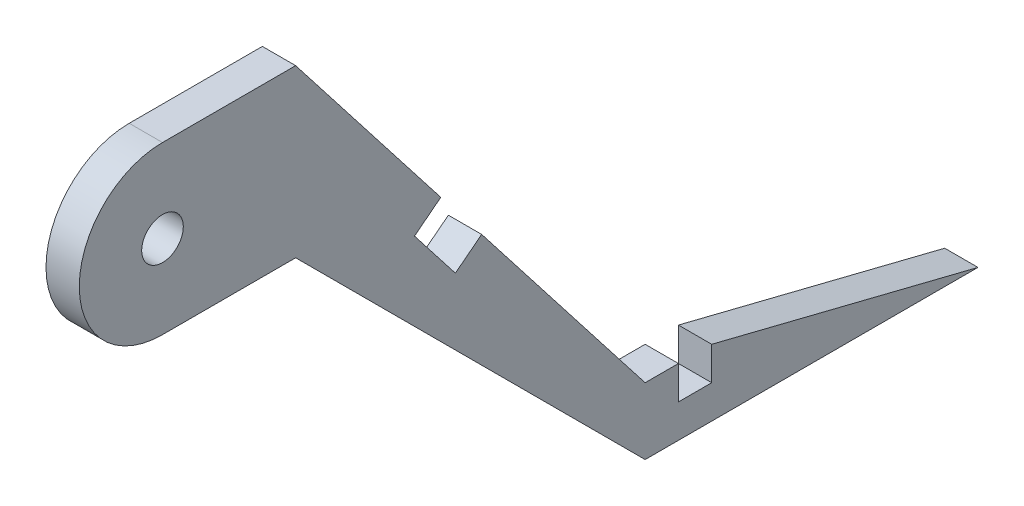
ISO-10303-21;
HEADER;
FILE_DESCRIPTION(('STEP AP214'),'2;1');
FILE_NAME('part.step','',(''),(''),'','','');
FILE_SCHEMA(('AUTOMOTIVE_DESIGN { 1 0 10303 214 1 1 1 1 }'));
ENDSEC;
DATA;
#1=APPLICATION_CONTEXT('core data for automotive mechanical design processes');
#2=APPLICATION_PROTOCOL_DEFINITION('international standard','automotive_design',2000,#1);
#3=PRODUCT_CONTEXT('',#1,'mechanical');
#4=PRODUCT('Part','Part','',(#3));
#5=PRODUCT_RELATED_PRODUCT_CATEGORY('part','',(#4));
#6=PRODUCT_DEFINITION_FORMATION('','',#4);
#7=PRODUCT_DEFINITION_CONTEXT('part definition',#1,'design');
#8=PRODUCT_DEFINITION('design','',#6,#7);
#9=PRODUCT_DEFINITION_SHAPE('','',#8);
#10=(LENGTH_UNIT() NAMED_UNIT(*) SI_UNIT(.MILLI.,.METRE.));
#11=(NAMED_UNIT(*) PLANE_ANGLE_UNIT() SI_UNIT($,.RADIAN.));
#12=(NAMED_UNIT(*) SI_UNIT($,.STERADIAN.) SOLID_ANGLE_UNIT());
#13=UNCERTAINTY_MEASURE_WITH_UNIT(LENGTH_MEASURE(1.E-05),#10,'distance_accuracy_value','');
#14=(GEOMETRIC_REPRESENTATION_CONTEXT(3) GLOBAL_UNCERTAINTY_ASSIGNED_CONTEXT((#13)) GLOBAL_UNIT_ASSIGNED_CONTEXT((#10,
#11,#12)) REPRESENTATION_CONTEXT('',''));
#15=CARTESIAN_POINT('',(0.,0.,0.));
#16=DIRECTION('',(0.,0.,1.));
#17=DIRECTION('',(1.,0.,0.));
#18=AXIS2_PLACEMENT_3D('',#15,#16,#17);
#19=CARTESIAN_POINT('',(12.7,-139.7,-184.150000000001));
#20=DIRECTION('',(0.,-0.613940613514922,0.789352217376325));
#21=DIRECTION('',(0.,-0.789352217376325,-0.613940613514922));
#22=AXIS2_PLACEMENT_3D('',#19,#20,#21);
#23=PLANE('',#22);
#24=DIRECTION('',(0.,0.789352217376325,0.613940613514922));
#25=VECTOR('',#24,1.);
#26=CARTESIAN_POINT('',(12.7,-139.7,-184.150000000001));
#27=LINE('',#26,#25);
#28=CARTESIAN_POINT('',(12.7,-39.4522683932067,-106.179542083605));
#29=VERTEX_POINT('',#28);
#30=CARTESIAN_POINT('',(12.7,31.75,-50.8));
#31=VERTEX_POINT('',#30);
#32=EDGE_CURVE('E234',#29,#31,#27,.T.);
#33=ORIENTED_EDGE('',*,*,#32,.F.);
#34=DIRECTION('',(1.,0.,0.));
#35=VECTOR('',#34,1.);
#36=CARTESIAN_POINT('',(12.7,-39.4522683932067,-106.179542083605));
#37=LINE('',#36,#35);
#38=CARTESIAN_POINT('',(0.,-39.4522683932067,-106.179542083605));
#39=VERTEX_POINT('',#38);
#40=EDGE_CURVE('E277',#39,#29,#37,.T.);
#41=ORIENTED_EDGE('',*,*,#40,.F.);
#42=DIRECTION('',(0.,0.789352217376325,0.613940613514922));
#43=VECTOR('',#42,1.);
#44=CARTESIAN_POINT('',(0.,-139.7,-184.150000000001));
#45=LINE('',#44,#43);
#46=CARTESIAN_POINT('',(0.,31.75,-50.8));
#47=VERTEX_POINT('',#46);
#48=EDGE_CURVE('E178',#39,#47,#45,.T.);
#49=ORIENTED_EDGE('',*,*,#48,.T.);
#50=DIRECTION('',(-1.,0.,0.));
#51=VECTOR('',#50,1.);
#52=CARTESIAN_POINT('',(12.7,31.75,-50.8));
#53=LINE('',#52,#51);
#54=EDGE_CURVE('E197',#31,#47,#53,.T.);
#55=ORIENTED_EDGE('',*,*,#54,.F.);
#56=EDGE_LOOP('',(#33,#41,#49,#55));
#57=FACE_BOUND('',#56,.T.);
#58=ADVANCED_FACE('F37',(#57),#23,.F.);
#59=CARTESIAN_POINT('',(12.7,-165.1,-311.15));
#60=DIRECTION('',(0.,-0.970142500145331,0.242535625036335));
#61=DIRECTION('',(0.,-0.242535625036335,-0.970142500145331));
#62=AXIS2_PLACEMENT_3D('',#59,#60,#61);
#63=PLANE('',#62);
#64=DIRECTION('',(0.,0.242535625036335,0.970142500145332));
#65=VECTOR('',#64,1.);
#66=CARTESIAN_POINT('',(0.,-165.1,-311.15));
#67=LINE('',#66,#65);
#68=CARTESIAN_POINT('',(0.,-165.1,-311.15));
#69=VERTEX_POINT('',#68);
#70=CARTESIAN_POINT('',(0.,-139.7,-209.550000000001));
#71=VERTEX_POINT('',#70);
#72=EDGE_CURVE('E166',#69,#71,#67,.T.);
#73=ORIENTED_EDGE('',*,*,#72,.T.);
#74=DIRECTION('',(-1.,0.,0.));
#75=VECTOR('',#74,1.);
#76=CARTESIAN_POINT('',(12.7,-139.7,-209.550000000001));
#77=LINE('',#76,#75);
#78=CARTESIAN_POINT('',(12.7,-139.7,-209.550000000001));
#79=VERTEX_POINT('',#78);
#80=EDGE_CURVE('E11',#79,#71,#77,.T.);
#81=ORIENTED_EDGE('',*,*,#80,.F.);
#82=DIRECTION('',(0.,0.242535625036335,0.970142500145332));
#83=VECTOR('',#82,1.);
#84=CARTESIAN_POINT('',(12.7,-165.1,-311.15));
#85=LINE('',#84,#83);
#86=CARTESIAN_POINT('',(12.7,-165.1,-311.15));
#87=VERTEX_POINT('',#86);
#88=EDGE_CURVE('E190',#87,#79,#85,.T.);
#89=ORIENTED_EDGE('',*,*,#88,.F.);
#90=DIRECTION('',(-1.,0.,0.));
#91=VECTOR('',#90,1.);
#92=CARTESIAN_POINT('',(12.7,-165.1,-311.15));
#93=LINE('',#92,#91);
#94=EDGE_CURVE('E162',#87,#69,#93,.T.);
#95=ORIENTED_EDGE('',*,*,#94,.T.);
#96=EDGE_LOOP('',(#73,#81,#89,#95));
#97=FACE_BOUND('',#96,.T.);
#98=ADVANCED_FACE('F39',(#97),#63,.F.);
#99=CARTESIAN_POINT('',(12.7,-139.7,-209.550000000001));
#100=DIRECTION('',(0.,0.,-1.));
#101=DIRECTION('',(0.,1.,0.));
#102=AXIS2_PLACEMENT_3D('',#99,#100,#101);
#103=PLANE('',#102);
#104=DIRECTION('',(0.,-1.,0.));
#105=VECTOR('',#104,1.);
#106=CARTESIAN_POINT('',(0.,-139.7,-209.550000000001));
#107=LINE('',#106,#105);
#108=CARTESIAN_POINT('',(0.,-152.4,-209.550000000001));
#109=VERTEX_POINT('',#108);
#110=EDGE_CURVE('E169',#71,#109,#107,.T.);
#111=ORIENTED_EDGE('',*,*,#110,.T.);
#112=DIRECTION('',(-1.,0.,0.));
#113=VECTOR('',#112,1.);
#114=CARTESIAN_POINT('',(12.7,-152.4,-209.550000000001));
#115=LINE('',#114,#113);
#116=CARTESIAN_POINT('',(12.7,-152.4,-209.550000000001));
#117=VERTEX_POINT('',#116);
#118=EDGE_CURVE('E45',#117,#109,#115,.T.);
#119=ORIENTED_EDGE('',*,*,#118,.F.);
#120=DIRECTION('',(0.,-1.,0.));
#121=VECTOR('',#120,1.);
#122=CARTESIAN_POINT('',(12.7,-139.7,-209.550000000001));
#123=LINE('',#122,#121);
#124=EDGE_CURVE('E111',#79,#117,#123,.T.);
#125=ORIENTED_EDGE('',*,*,#124,.F.);
#126=ORIENTED_EDGE('',*,*,#80,.T.);
#127=EDGE_LOOP('',(#111,#119,#125,#126));
#128=FACE_BOUND('',#127,.T.);
#129=ADVANCED_FACE('F320',(#128),#103,.F.);
#130=CARTESIAN_POINT('',(12.7,-152.4,-209.550000000001));
#131=DIRECTION('',(0.,-1.,0.));
#132=DIRECTION('',(0.,0.,-1.));
#133=AXIS2_PLACEMENT_3D('',#130,#131,#132);
#134=PLANE('',#133);
#135=DIRECTION('',(0.,0.,1.));
#136=VECTOR('',#135,1.);
#137=CARTESIAN_POINT('',(0.,-152.4,-209.550000000001));
#138=LINE('',#137,#136);
#139=CARTESIAN_POINT('',(0.,-152.4,-196.850000000001));
#140=VERTEX_POINT('',#139);
#141=EDGE_CURVE('E172',#109,#140,#138,.T.);
#142=ORIENTED_EDGE('',*,*,#141,.T.);
#143=DIRECTION('',(-1.,0.,0.));
#144=VECTOR('',#143,1.);
#145=CARTESIAN_POINT('',(12.7,-152.4,-196.850000000001));
#146=LINE('',#145,#144);
#147=CARTESIAN_POINT('',(12.7,-152.4,-196.850000000001));
#148=VERTEX_POINT('',#147);
#149=EDGE_CURVE('E206',#148,#140,#146,.T.);
#150=ORIENTED_EDGE('',*,*,#149,.F.);
#151=DIRECTION('',(0.,0.,1.));
#152=VECTOR('',#151,1.);
#153=CARTESIAN_POINT('',(12.7,-152.4,-209.550000000001));
#154=LINE('',#153,#152);
#155=EDGE_CURVE('E214',#117,#148,#154,.T.);
#156=ORIENTED_EDGE('',*,*,#155,.F.);
#157=ORIENTED_EDGE('',*,*,#118,.T.);
#158=EDGE_LOOP('',(#142,#150,#156,#157));
#159=FACE_BOUND('',#158,.T.);
#160=ADVANCED_FACE('F212',(#159),#134,.F.);
#161=CARTESIAN_POINT('',(12.7,-152.4,-196.850000000001));
#162=DIRECTION('',(0.,0.,1.));
#163=DIRECTION('',(1.,0.,0.));
#164=AXIS2_PLACEMENT_3D('',#161,#162,#163);
#165=PLANE('',#164);
#166=DIRECTION('',(0.,1.,0.));
#167=VECTOR('',#166,1.);
#168=CARTESIAN_POINT('',(0.,-152.4,-196.850000000001));
#169=LINE('',#168,#167);
#170=CARTESIAN_POINT('',(0.,-139.7,-196.850000000001));
#171=VERTEX_POINT('',#170);
#172=EDGE_CURVE('E174',#140,#171,#169,.T.);
#173=ORIENTED_EDGE('',*,*,#172,.T.);
#174=DIRECTION('',(-1.,0.,0.));
#175=VECTOR('',#174,1.);
#176=CARTESIAN_POINT('',(12.7,-139.7,-196.850000000001));
#177=LINE('',#176,#175);
#178=CARTESIAN_POINT('',(12.7,-139.7,-196.850000000001));
#179=VERTEX_POINT('',#178);
#180=EDGE_CURVE('E203',#179,#171,#177,.T.);
#181=ORIENTED_EDGE('',*,*,#180,.F.);
#182=DIRECTION('',(0.,1.,0.));
#183=VECTOR('',#182,1.);
#184=CARTESIAN_POINT('',(12.7,-152.4,-196.850000000001));
#185=LINE('',#184,#183);
#186=EDGE_CURVE('E235',#148,#179,#185,.T.);
#187=ORIENTED_EDGE('',*,*,#186,.F.);
#188=ORIENTED_EDGE('',*,*,#149,.T.);
#189=EDGE_LOOP('',(#173,#181,#187,#188));
#190=FACE_BOUND('',#189,.T.);
#191=ADVANCED_FACE('F225',(#190),#165,.F.);
#192=CARTESIAN_POINT('',(12.7,-139.7,-196.850000000001));
#193=DIRECTION('',(0.,-1.,0.));
#194=DIRECTION('',(0.,0.,-1.));
#195=AXIS2_PLACEMENT_3D('',#192,#193,#194);
#196=PLANE('',#195);
#197=DIRECTION('',(0.,0.,1.));
#198=VECTOR('',#197,1.);
#199=CARTESIAN_POINT('',(0.,-139.7,-196.850000000001));
#200=LINE('',#199,#198);
#201=CARTESIAN_POINT('',(0.,-139.7,-184.150000000001));
#202=VERTEX_POINT('',#201);
#203=EDGE_CURVE('E176',#171,#202,#200,.T.);
#204=ORIENTED_EDGE('',*,*,#203,.T.);
#205=DIRECTION('',(-1.,0.,0.));
#206=VECTOR('',#205,1.);
#207=CARTESIAN_POINT('',(12.7,-139.7,-184.150000000001));
#208=LINE('',#207,#206);
#209=CARTESIAN_POINT('',(12.7,-139.7,-184.150000000001));
#210=VERTEX_POINT('',#209);
#211=EDGE_CURVE('E200',#210,#202,#208,.T.);
#212=ORIENTED_EDGE('',*,*,#211,.F.);
#213=DIRECTION('',(0.,0.,1.));
#214=VECTOR('',#213,1.);
#215=CARTESIAN_POINT('',(12.7,-139.7,-196.850000000001));
#216=LINE('',#215,#214);
#217=EDGE_CURVE('E231',#179,#210,#216,.T.);
#218=ORIENTED_EDGE('',*,*,#217,.F.);
#219=ORIENTED_EDGE('',*,*,#180,.T.);
#220=EDGE_LOOP('',(#204,#212,#218,#219));
#221=FACE_BOUND('',#220,.T.);
#222=ADVANCED_FACE('F229',(#221),#196,.F.);
#223=CARTESIAN_POINT('',(0.,-59.5018147145653,-121.773633666885));
#224=VERTEX_POINT('',#223);
#225=EDGE_CURVE('E179',#202,#224,#45,.T.);
#226=ORIENTED_EDGE('',*,*,#225,.T.);
#227=DIRECTION('',(-1.,0.,0.));
#228=VECTOR('',#227,1.);
#229=CARTESIAN_POINT('',(12.7,-59.5018147145653,-121.773633666885));
#230=LINE('',#229,#228);
#231=CARTESIAN_POINT('',(12.7,-59.5018147145653,-121.773633666885));
#232=VERTEX_POINT('',#231);
#233=EDGE_CURVE('E281',#232,#224,#230,.T.);
#234=ORIENTED_EDGE('',*,*,#233,.F.);
#235=EDGE_CURVE('E237',#210,#232,#27,.T.);
#236=ORIENTED_EDGE('',*,*,#235,.F.);
#237=ORIENTED_EDGE('',*,*,#211,.T.);
#238=EDGE_LOOP('',(#226,#234,#236,#237));
#239=FACE_BOUND('',#238,.T.);
#240=ADVANCED_FACE('F303',(#239),#23,.F.);
#241=CARTESIAN_POINT('',(12.7,31.75,0.));
#242=DIRECTION('',(0.,-1.,0.));
#243=DIRECTION('',(0.,0.,-1.));
#244=AXIS2_PLACEMENT_3D('',#241,#242,#243);
#245=PLANE('',#244);
#246=DIRECTION('',(0.,0.,1.));
#247=VECTOR('',#246,1.);
#248=CARTESIAN_POINT('',(0.,31.75,0.));
#249=LINE('',#248,#247);
#250=CARTESIAN_POINT('',(0.,31.75,0.));
#251=VERTEX_POINT('',#250);
#252=EDGE_CURVE('E182',#47,#251,#249,.T.);
#253=ORIENTED_EDGE('',*,*,#252,.T.);
#254=DIRECTION('',(-1.,0.,0.));
#255=VECTOR('',#254,1.);
#256=CARTESIAN_POINT('',(12.7,31.75,0.));
#257=LINE('',#256,#255);
#258=CARTESIAN_POINT('',(12.7,31.75,0.));
#259=VERTEX_POINT('',#258);
#260=EDGE_CURVE('E194',#259,#251,#257,.T.);
#261=ORIENTED_EDGE('',*,*,#260,.F.);
#262=DIRECTION('',(0.,0.,1.));
#263=VECTOR('',#262,1.);
#264=CARTESIAN_POINT('',(12.7,31.75,0.));
#265=LINE('',#264,#263);
#266=EDGE_CURVE('E242',#31,#259,#265,.T.);
#267=ORIENTED_EDGE('',*,*,#266,.F.);
#268=ORIENTED_EDGE('',*,*,#54,.T.);
#269=EDGE_LOOP('',(#253,#261,#267,#268));
#270=FACE_BOUND('',#269,.T.);
#271=ADVANCED_FACE('F248',(#270),#245,.F.);
#272=CARTESIAN_POINT('',(12.7,0.,0.));
#273=DIRECTION('',(-1.,0.,0.));
#274=DIRECTION('',(0.,0.,1.));
#275=AXIS2_PLACEMENT_3D('',#272,#273,#274);
#276=CYLINDRICAL_SURFACE('',#275,31.75);
#277=CARTESIAN_POINT('',(0.,0.,0.));
#278=DIRECTION('',(1.,0.,0.));
#279=DIRECTION('',(0.,0.,-1.));
#280=AXIS2_PLACEMENT_3D('',#277,#278,#279);
#281=CIRCLE('',#280,31.75);
#282=CARTESIAN_POINT('',(0.,-31.75,0.));
#283=VERTEX_POINT('',#282);
#284=EDGE_CURVE('E184',#251,#283,#281,.T.);
#285=ORIENTED_EDGE('',*,*,#284,.T.);
#286=DIRECTION('',(-1.,0.,0.));
#287=VECTOR('',#286,1.);
#288=CARTESIAN_POINT('',(12.7,-31.75,0.));
#289=LINE('',#288,#287);
#290=CARTESIAN_POINT('',(12.7,-31.75,0.));
#291=VERTEX_POINT('',#290);
#292=EDGE_CURVE('E157',#291,#283,#289,.T.);
#293=ORIENTED_EDGE('',*,*,#292,.F.);
#294=CARTESIAN_POINT('',(12.7,0.,0.));
#295=DIRECTION('',(1.,0.,0.));
#296=DIRECTION('',(0.,0.,-1.));
#297=AXIS2_PLACEMENT_3D('',#294,#295,#296);
#298=CIRCLE('',#297,31.75);
#299=EDGE_CURVE('E145',#259,#291,#298,.T.);
#300=ORIENTED_EDGE('',*,*,#299,.F.);
#301=ORIENTED_EDGE('',*,*,#260,.T.);
#302=EDGE_LOOP('',(#285,#293,#300,#301));
#303=FACE_BOUND('',#302,.T.);
#304=ADVANCED_FACE('F252',(#303),#276,.T.);
#305=CARTESIAN_POINT('',(12.7,-31.75,0.));
#306=DIRECTION('',(0.,1.,0.));
#307=DIRECTION('',(0.,0.,1.));
#308=AXIS2_PLACEMENT_3D('',#305,#306,#307);
#309=PLANE('',#308);
#310=DIRECTION('',(0.,0.,-1.));
#311=VECTOR('',#310,1.);
#312=CARTESIAN_POINT('',(0.,-31.75,0.));
#313=LINE('',#312,#311);
#314=CARTESIAN_POINT('',(0.,-31.75,-50.8));
#315=VERTEX_POINT('',#314);
#316=EDGE_CURVE('E154',#283,#315,#313,.T.);
#317=ORIENTED_EDGE('',*,*,#316,.T.);
#318=DIRECTION('',(-1.,0.,0.));
#319=VECTOR('',#318,1.);
#320=CARTESIAN_POINT('',(12.7,-31.75,-50.8));
#321=LINE('',#320,#319);
#322=CARTESIAN_POINT('',(12.7,-31.75,-50.8));
#323=VERTEX_POINT('',#322);
#324=EDGE_CURVE('E151',#323,#315,#321,.T.);
#325=ORIENTED_EDGE('',*,*,#324,.F.);
#326=DIRECTION('',(0.,0.,-1.));
#327=VECTOR('',#326,1.);
#328=CARTESIAN_POINT('',(12.7,-31.75,0.));
#329=LINE('',#328,#327);
#330=EDGE_CURVE('E136',#291,#323,#329,.T.);
#331=ORIENTED_EDGE('',*,*,#330,.F.);
#332=ORIENTED_EDGE('',*,*,#292,.T.);
#333=EDGE_LOOP('',(#317,#325,#331,#332));
#334=FACE_BOUND('',#333,.T.);
#335=ADVANCED_FACE('F152',(#334),#309,.F.);
#336=CARTESIAN_POINT('',(12.7,-31.75,-50.8));
#337=DIRECTION('',(0.,0.707106781186547,-0.707106781186548));
#338=DIRECTION('',(0.,0.707106781186548,0.707106781186547));
#339=AXIS2_PLACEMENT_3D('',#336,#337,#338);
#340=PLANE('',#339);
#341=DIRECTION('',(0.,-0.707106781186548,-0.707106781186546));
#342=VECTOR('',#341,1.);
#343=CARTESIAN_POINT('',(0.,-31.75,-50.8));
#344=LINE('',#343,#342);
#345=CARTESIAN_POINT('',(0.,-165.1,-184.15));
#346=VERTEX_POINT('',#345);
#347=EDGE_CURVE('E187',#315,#346,#344,.T.);
#348=ORIENTED_EDGE('',*,*,#347,.T.);
#349=DIRECTION('',(-1.,0.,0.));
#350=VECTOR('',#349,1.);
#351=CARTESIAN_POINT('',(12.7,-165.1,-184.15));
#352=LINE('',#351,#350);
#353=CARTESIAN_POINT('',(12.7,-165.1,-184.15));
#354=VERTEX_POINT('',#353);
#355=EDGE_CURVE('E158',#354,#346,#352,.T.);
#356=ORIENTED_EDGE('',*,*,#355,.F.);
#357=DIRECTION('',(0.,-0.707106781186548,-0.707106781186546));
#358=VECTOR('',#357,1.);
#359=CARTESIAN_POINT('',(12.7,-31.75,-50.8));
#360=LINE('',#359,#358);
#361=EDGE_CURVE('E142',#323,#354,#360,.T.);
#362=ORIENTED_EDGE('',*,*,#361,.F.);
#363=ORIENTED_EDGE('',*,*,#324,.T.);
#364=EDGE_LOOP('',(#348,#356,#362,#363));
#365=FACE_BOUND('',#364,.T.);
#366=ADVANCED_FACE('F160',(#365),#340,.F.);
#367=CARTESIAN_POINT('',(12.7,-165.1,-184.15));
#368=DIRECTION('',(0.,1.,0.));
#369=DIRECTION('',(0.,0.,1.));
#370=AXIS2_PLACEMENT_3D('',#367,#368,#369);
#371=PLANE('',#370);
#372=DIRECTION('',(0.,0.,-1.));
#373=VECTOR('',#372,1.);
#374=CARTESIAN_POINT('',(0.,-165.1,-184.15));
#375=LINE('',#374,#373);
#376=EDGE_CURVE('E103',#346,#69,#375,.T.);
#377=ORIENTED_EDGE('',*,*,#376,.T.);
#378=ORIENTED_EDGE('',*,*,#94,.F.);
#379=DIRECTION('',(0.,0.,-1.));
#380=VECTOR('',#379,1.);
#381=CARTESIAN_POINT('',(12.7,-165.1,-184.15));
#382=LINE('',#381,#380);
#383=EDGE_CURVE('E61',#354,#87,#382,.T.);
#384=ORIENTED_EDGE('',*,*,#383,.F.);
#385=ORIENTED_EDGE('',*,*,#355,.T.);
#386=EDGE_LOOP('',(#377,#378,#384,#385));
#387=FACE_BOUND('',#386,.T.);
#388=ADVANCED_FACE('F253',(#387),#371,.F.);
#389=CARTESIAN_POINT('',(12.7,0.,0.));
#390=DIRECTION('',(1.,0.,0.));
#391=DIRECTION('',(0.,0.,-1.));
#392=AXIS2_PLACEMENT_3D('',#389,#390,#391);
#393=PLANE('',#392);
#394=DIRECTION('',(0.,0.613940613514922,-0.789352217376325));
#395=VECTOR('',#394,1.);
#396=CARTESIAN_POINT('',(12.7,-47.2493141848462,-96.1547689229262));
#397=LINE('',#396,#395);
#398=CARTESIAN_POINT('',(12.7,-47.2493141848462,-96.1547689229262));
#399=VERTEX_POINT('',#398);
#400=EDGE_CURVE('E265',#399,#29,#397,.T.);
#401=ORIENTED_EDGE('',*,*,#400,.T.);
#402=ORIENTED_EDGE('',*,*,#32,.T.);
#403=ORIENTED_EDGE('',*,*,#266,.T.);
#404=ORIENTED_EDGE('',*,*,#299,.T.);
#405=ORIENTED_EDGE('',*,*,#330,.T.);
#406=ORIENTED_EDGE('',*,*,#361,.T.);
#407=ORIENTED_EDGE('',*,*,#383,.T.);
#408=ORIENTED_EDGE('',*,*,#88,.T.);
#409=ORIENTED_EDGE('',*,*,#124,.T.);
#410=ORIENTED_EDGE('',*,*,#155,.T.);
#411=ORIENTED_EDGE('',*,*,#186,.T.);
#412=ORIENTED_EDGE('',*,*,#217,.T.);
#413=ORIENTED_EDGE('',*,*,#235,.T.);
#414=DIRECTION('',(0.,0.613940613514922,-0.789352217376325));
#415=VECTOR('',#414,1.);
#416=CARTESIAN_POINT('',(12.7,-67.2988605062049,-111.748860506205));
#417=LINE('',#416,#415);
#418=CARTESIAN_POINT('',(12.7,-67.2988605062049,-111.748860506205));
#419=VERTEX_POINT('',#418);
#420=EDGE_CURVE('E266',#419,#232,#417,.T.);
#421=ORIENTED_EDGE('',*,*,#420,.F.);
#422=DIRECTION('',(0.,-0.789352217376325,-0.613940613514922));
#423=VECTOR('',#422,1.);
#424=CARTESIAN_POINT('',(12.7,-47.2493141848462,-96.1547689229262));
#425=LINE('',#424,#423);
#426=EDGE_CURVE('E280',#399,#419,#425,.T.);
#427=ORIENTED_EDGE('',*,*,#426,.F.);
#428=EDGE_LOOP('',(#401,#402,#403,#404,#405,#406,#407,#408,#409,#410,#411,#412,#413,#421,#427));
#429=FACE_BOUND('',#428,.T.);
#430=CARTESIAN_POINT('',(12.7,0.,0.));
#431=DIRECTION('',(1.,0.,0.));
#432=DIRECTION('',(0.,0.,-1.));
#433=AXIS2_PLACEMENT_3D('',#430,#431,#432);
#434=CIRCLE('',#433,7.9375);
#435=CARTESIAN_POINT('',(12.7,0.,-7.9375));
#436=VERTEX_POINT('',#435);
#437=EDGE_CURVE('E262',#436,#436,#434,.T.);
#438=ORIENTED_EDGE('',*,*,#437,.F.);
#439=EDGE_LOOP('',(#438));
#440=FACE_BOUND('',#439,.T.);
#441=ADVANCED_FACE('F139',(#429,#440),#393,.T.);
#442=CARTESIAN_POINT('',(0.,0.,0.));
#443=DIRECTION('',(1.,0.,0.));
#444=DIRECTION('',(0.,0.,-1.));
#445=AXIS2_PLACEMENT_3D('',#442,#443,#444);
#446=PLANE('',#445);
#447=ORIENTED_EDGE('',*,*,#48,.F.);
#448=DIRECTION('',(0.,0.613940613514922,-0.789352217376325));
#449=VECTOR('',#448,1.);
#450=CARTESIAN_POINT('',(0.,-47.2493141848462,-96.1547689229262));
#451=LINE('',#450,#449);
#452=CARTESIAN_POINT('',(0.,-47.2493141848462,-96.1547689229262));
#453=VERTEX_POINT('',#452);
#454=EDGE_CURVE('E273',#453,#39,#451,.T.);
#455=ORIENTED_EDGE('',*,*,#454,.F.);
#456=DIRECTION('',(0.,0.789352217376325,0.613940613514922));
#457=VECTOR('',#456,1.);
#458=CARTESIAN_POINT('',(0.,-47.2493141848462,-96.1547689229262));
#459=LINE('',#458,#457);
#460=CARTESIAN_POINT('',(0.,-67.2988605062049,-111.748860506205));
#461=VERTEX_POINT('',#460);
#462=EDGE_CURVE('E286',#461,#453,#459,.T.);
#463=ORIENTED_EDGE('',*,*,#462,.F.);
#464=DIRECTION('',(0.,0.613940613514922,-0.789352217376325));
#465=VECTOR('',#464,1.);
#466=CARTESIAN_POINT('',(0.,-67.2988605062049,-111.748860506205));
#467=LINE('',#466,#465);
#468=EDGE_CURVE('E269',#461,#224,#467,.T.);
#469=ORIENTED_EDGE('',*,*,#468,.T.);
#470=ORIENTED_EDGE('',*,*,#225,.F.);
#471=ORIENTED_EDGE('',*,*,#203,.F.);
#472=ORIENTED_EDGE('',*,*,#172,.F.);
#473=ORIENTED_EDGE('',*,*,#141,.F.);
#474=ORIENTED_EDGE('',*,*,#110,.F.);
#475=ORIENTED_EDGE('',*,*,#72,.F.);
#476=ORIENTED_EDGE('',*,*,#376,.F.);
#477=ORIENTED_EDGE('',*,*,#347,.F.);
#478=ORIENTED_EDGE('',*,*,#316,.F.);
#479=ORIENTED_EDGE('',*,*,#284,.F.);
#480=ORIENTED_EDGE('',*,*,#252,.F.);
#481=EDGE_LOOP('',(#447,#455,#463,#469,#470,#471,#472,#473,#474,#475,#476,#477,#478,#479,#480));
#482=FACE_BOUND('',#481,.T.);
#483=CARTESIAN_POINT('',(0.,0.,0.));
#484=DIRECTION('',(1.,0.,0.));
#485=DIRECTION('',(0.,0.,-1.));
#486=AXIS2_PLACEMENT_3D('',#483,#484,#485);
#487=CIRCLE('',#486,7.9375);
#488=CARTESIAN_POINT('',(0.,0.,-7.9375));
#489=VERTEX_POINT('',#488);
#490=EDGE_CURVE('E170',#489,#489,#487,.F.);
#491=ORIENTED_EDGE('',*,*,#490,.F.);
#492=EDGE_LOOP('',(#491));
#493=FACE_BOUND('',#492,.T.);
#494=ADVANCED_FACE('F218',(#482,#493),#446,.F.);
#495=CARTESIAN_POINT('',(-22.4506403026729,0.,0.));
#496=DIRECTION('',(1.,0.,0.));
#497=DIRECTION('',(0.,0.,-1.));
#498=AXIS2_PLACEMENT_3D('',#495,#496,#497);
#499=CYLINDRICAL_SURFACE('',#498,7.9375);
#500=ORIENTED_EDGE('',*,*,#490,.T.);
#501=EDGE_LOOP('',(#500));
#502=FACE_BOUND('',#501,.T.);
#503=ORIENTED_EDGE('',*,*,#437,.T.);
#504=EDGE_LOOP('',(#503));
#505=FACE_BOUND('',#504,.T.);
#506=ADVANCED_FACE('F397',(#502,#505),#499,.F.);
#507=CARTESIAN_POINT('',(12.7,-47.2493141848462,-96.1547689229262));
#508=DIRECTION('',(0.,0.789352217376325,0.613940613514922));
#509=DIRECTION('',(0.,-0.613940613514922,0.789352217376325));
#510=AXIS2_PLACEMENT_3D('',#507,#508,#509);
#511=PLANE('',#510);
#512=ORIENTED_EDGE('',*,*,#40,.T.);
#513=ORIENTED_EDGE('',*,*,#400,.F.);
#514=DIRECTION('',(1.,0.,0.));
#515=VECTOR('',#514,1.);
#516=CARTESIAN_POINT('',(12.7,-47.2493141848462,-96.1547689229262));
#517=LINE('',#516,#515);
#518=EDGE_CURVE('E270',#453,#399,#517,.T.);
#519=ORIENTED_EDGE('',*,*,#518,.F.);
#520=ORIENTED_EDGE('',*,*,#454,.T.);
#521=EDGE_LOOP('',(#512,#513,#519,#520));
#522=FACE_BOUND('',#521,.T.);
#523=ADVANCED_FACE('F311',(#522),#511,.F.);
#524=CARTESIAN_POINT('',(12.7,-67.2988605062049,-111.748860506205));
#525=DIRECTION('',(0.,-0.789352217376325,-0.613940613514922));
#526=DIRECTION('',(0.,0.613940613514922,-0.789352217376325));
#527=AXIS2_PLACEMENT_3D('',#524,#525,#526);
#528=PLANE('',#527);
#529=ORIENTED_EDGE('',*,*,#233,.T.);
#530=ORIENTED_EDGE('',*,*,#468,.F.);
#531=DIRECTION('',(-1.,0.,0.));
#532=VECTOR('',#531,1.);
#533=CARTESIAN_POINT('',(12.7,-67.2988605062049,-111.748860506205));
#534=LINE('',#533,#532);
#535=EDGE_CURVE('E52',#419,#461,#534,.T.);
#536=ORIENTED_EDGE('',*,*,#535,.F.);
#537=ORIENTED_EDGE('',*,*,#420,.T.);
#538=EDGE_LOOP('',(#529,#530,#536,#537));
#539=FACE_BOUND('',#538,.T.);
#540=ADVANCED_FACE('F299',(#539),#528,.F.);
#541=CARTESIAN_POINT('',(0.,28.7887234391298,-37.0140729931668));
#542=DIRECTION('',(0.,0.613940613514922,-0.789352217376325));
#543=DIRECTION('',(0.,0.789352217376325,0.613940613514922));
#544=AXIS2_PLACEMENT_3D('',#541,#542,#543);
#545=PLANE('',#544);
#546=ORIENTED_EDGE('',*,*,#426,.T.);
#547=ORIENTED_EDGE('',*,*,#535,.T.);
#548=ORIENTED_EDGE('',*,*,#462,.T.);
#549=ORIENTED_EDGE('',*,*,#518,.T.);
#550=EDGE_LOOP('',(#546,#547,#548,#549));
#551=FACE_BOUND('',#550,.T.);
#552=ADVANCED_FACE('F292',(#551),#545,.T.);
#553=CLOSED_SHELL('',(#58,#98,#129,#160,#191,#222,#240,#271,#304,#335,#366,#388,#441,#494,#506,
#523,#540,#552));
#554=MANIFOLD_SOLID_BREP('B2',#553);
#555=ADVANCED_BREP_SHAPE_REPRESENTATION('',(#18,#554),#14);
#556=SHAPE_DEFINITION_REPRESENTATION(#9,#555);
ENDSEC;
END-ISO-10303-21;
